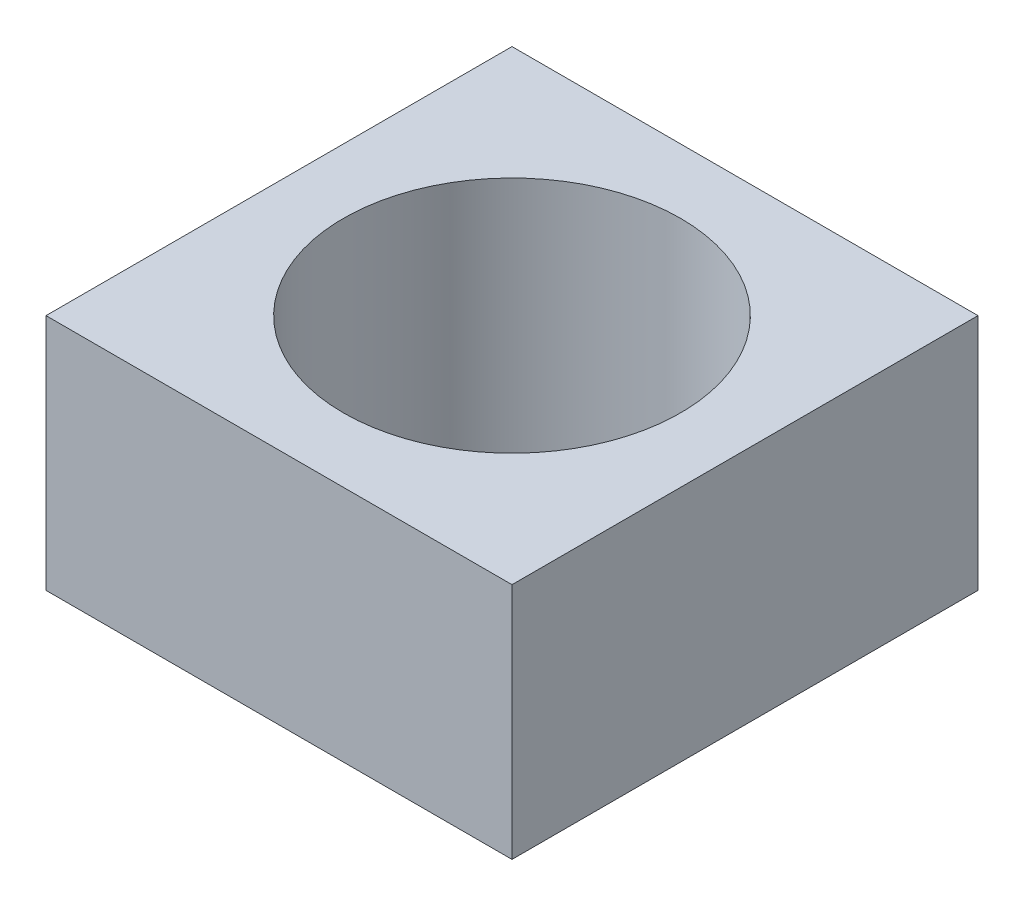
ISO-10303-21;
HEADER;
FILE_DESCRIPTION(('STEP AP214'),'2;1');
FILE_NAME('part.step','',(''),(''),'','','');
FILE_SCHEMA(('AUTOMOTIVE_DESIGN { 1 0 10303 214 1 1 1 1 }'));
ENDSEC;
DATA;
#1=APPLICATION_CONTEXT('core data for automotive mechanical design processes');
#2=APPLICATION_PROTOCOL_DEFINITION('international standard','automotive_design',2000,#1);
#3=PRODUCT_CONTEXT('',#1,'mechanical');
#4=PRODUCT('Part','Part','',(#3));
#5=PRODUCT_RELATED_PRODUCT_CATEGORY('part','',(#4));
#6=PRODUCT_DEFINITION_FORMATION('','',#4);
#7=PRODUCT_DEFINITION_CONTEXT('part definition',#1,'design');
#8=PRODUCT_DEFINITION('design','',#6,#7);
#9=PRODUCT_DEFINITION_SHAPE('','',#8);
#10=(LENGTH_UNIT() NAMED_UNIT(*) SI_UNIT(.MILLI.,.METRE.));
#11=(NAMED_UNIT(*) PLANE_ANGLE_UNIT() SI_UNIT($,.RADIAN.));
#12=(NAMED_UNIT(*) SI_UNIT($,.STERADIAN.) SOLID_ANGLE_UNIT());
#13=UNCERTAINTY_MEASURE_WITH_UNIT(LENGTH_MEASURE(1.E-05),#10,'distance_accuracy_value','');
#14=(GEOMETRIC_REPRESENTATION_CONTEXT(3) GLOBAL_UNCERTAINTY_ASSIGNED_CONTEXT((#13)) GLOBAL_UNIT_ASSIGNED_CONTEXT((#10,
#11,#12)) REPRESENTATION_CONTEXT('',''));
#15=CARTESIAN_POINT('',(0.,0.,0.));
#16=DIRECTION('',(0.,0.,1.));
#17=DIRECTION('',(1.,0.,0.));
#18=AXIS2_PLACEMENT_3D('',#15,#16,#17);
#19=CARTESIAN_POINT('',(37.30625,38.1,-37.30625));
#20=DIRECTION('',(-1.,0.,0.));
#21=DIRECTION('',(0.,0.,1.));
#22=AXIS2_PLACEMENT_3D('',#19,#20,#21);
#23=PLANE('',#22);
#24=DIRECTION('',(0.,0.,-1.));
#25=VECTOR('',#24,1.);
#26=CARTESIAN_POINT('',(37.30625,0.,-37.30625));
#27=LINE('',#26,#25);
#28=CARTESIAN_POINT('',(37.30625,0.,37.30625));
#29=VERTEX_POINT('',#28);
#30=CARTESIAN_POINT('',(37.30625,0.,-37.30625));
#31=VERTEX_POINT('',#30);
#32=EDGE_CURVE('E113',#29,#31,#27,.T.);
#33=ORIENTED_EDGE('',*,*,#32,.T.);
#34=DIRECTION('',(0.,-1.,0.));
#35=VECTOR('',#34,1.);
#36=CARTESIAN_POINT('',(37.30625,38.1,-37.30625));
#37=LINE('',#36,#35);
#38=CARTESIAN_POINT('',(37.30625,38.1,-37.30625));
#39=VERTEX_POINT('',#38);
#40=EDGE_CURVE('E11',#39,#31,#37,.T.);
#41=ORIENTED_EDGE('',*,*,#40,.F.);
#42=DIRECTION('',(0.,0.,-1.));
#43=VECTOR('',#42,1.);
#44=CARTESIAN_POINT('',(37.30625,38.1,-37.30625));
#45=LINE('',#44,#43);
#46=CARTESIAN_POINT('',(37.30625,38.1,37.30625));
#47=VERTEX_POINT('',#46);
#48=EDGE_CURVE('E97',#47,#39,#45,.T.);
#49=ORIENTED_EDGE('',*,*,#48,.F.);
#50=DIRECTION('',(0.,-1.,0.));
#51=VECTOR('',#50,1.);
#52=CARTESIAN_POINT('',(37.30625,38.1,37.30625));
#53=LINE('',#52,#51);
#54=EDGE_CURVE('E109',#47,#29,#53,.T.);
#55=ORIENTED_EDGE('',*,*,#54,.T.);
#56=EDGE_LOOP('',(#33,#41,#49,#55));
#57=FACE_BOUND('',#56,.T.);
#58=ADVANCED_FACE('F45',(#57),#23,.F.);
#59=CARTESIAN_POINT('',(-37.30625,38.1,-37.30625));
#60=DIRECTION('',(0.,0.,1.));
#61=DIRECTION('',(1.,0.,0.));
#62=AXIS2_PLACEMENT_3D('',#59,#60,#61);
#63=PLANE('',#62);
#64=DIRECTION('',(-1.,0.,0.));
#65=VECTOR('',#64,1.);
#66=CARTESIAN_POINT('',(-37.30625,0.,-37.30625));
#67=LINE('',#66,#65);
#68=CARTESIAN_POINT('',(-37.30625,0.,-37.30625));
#69=VERTEX_POINT('',#68);
#70=EDGE_CURVE('E102',#31,#69,#67,.T.);
#71=ORIENTED_EDGE('',*,*,#70,.T.);
#72=DIRECTION('',(0.,-1.,0.));
#73=VECTOR('',#72,1.);
#74=CARTESIAN_POINT('',(-37.30625,38.1,-37.30625));
#75=LINE('',#74,#73);
#76=CARTESIAN_POINT('',(-37.30625,38.1,-37.30625));
#77=VERTEX_POINT('',#76);
#78=EDGE_CURVE('E54',#77,#69,#75,.T.);
#79=ORIENTED_EDGE('',*,*,#78,.F.);
#80=DIRECTION('',(-1.,0.,0.));
#81=VECTOR('',#80,1.);
#82=CARTESIAN_POINT('',(-37.30625,38.1,-37.30625));
#83=LINE('',#82,#81);
#84=EDGE_CURVE('E92',#39,#77,#83,.T.);
#85=ORIENTED_EDGE('',*,*,#84,.F.);
#86=ORIENTED_EDGE('',*,*,#40,.T.);
#87=EDGE_LOOP('',(#71,#79,#85,#86));
#88=FACE_BOUND('',#87,.T.);
#89=ADVANCED_FACE('F101',(#88),#63,.F.);
#90=CARTESIAN_POINT('',(-37.30625,38.1,-37.30625));
#91=DIRECTION('',(1.,0.,0.));
#92=DIRECTION('',(0.,0.,-1.));
#93=AXIS2_PLACEMENT_3D('',#90,#91,#92);
#94=PLANE('',#93);
#95=DIRECTION('',(0.,0.,1.));
#96=VECTOR('',#95,1.);
#97=CARTESIAN_POINT('',(-37.30625,0.,-37.30625));
#98=LINE('',#97,#96);
#99=CARTESIAN_POINT('',(-37.30625,0.,37.30625));
#100=VERTEX_POINT('',#99);
#101=EDGE_CURVE('E79',#69,#100,#98,.T.);
#102=ORIENTED_EDGE('',*,*,#101,.T.);
#103=DIRECTION('',(0.,-1.,0.));
#104=VECTOR('',#103,1.);
#105=CARTESIAN_POINT('',(-37.30625,38.1,37.30625));
#106=LINE('',#105,#104);
#107=CARTESIAN_POINT('',(-37.30625,38.1,37.30625));
#108=VERTEX_POINT('',#107);
#109=EDGE_CURVE('E104',#108,#100,#106,.T.);
#110=ORIENTED_EDGE('',*,*,#109,.F.);
#111=DIRECTION('',(0.,0.,1.));
#112=VECTOR('',#111,1.);
#113=CARTESIAN_POINT('',(-37.30625,38.1,-37.30625));
#114=LINE('',#113,#112);
#115=EDGE_CURVE('E95',#77,#108,#114,.T.);
#116=ORIENTED_EDGE('',*,*,#115,.F.);
#117=ORIENTED_EDGE('',*,*,#78,.T.);
#118=EDGE_LOOP('',(#102,#110,#116,#117));
#119=FACE_BOUND('',#118,.T.);
#120=ADVANCED_FACE('F105',(#119),#94,.F.);
#121=CARTESIAN_POINT('',(-37.30625,38.1,37.30625));
#122=DIRECTION('',(0.,0.,-1.));
#123=DIRECTION('',(-1.,0.,0.));
#124=AXIS2_PLACEMENT_3D('',#121,#122,#123);
#125=PLANE('',#124);
#126=DIRECTION('',(1.,0.,0.));
#127=VECTOR('',#126,1.);
#128=CARTESIAN_POINT('',(-37.30625,0.,37.30625));
#129=LINE('',#128,#127);
#130=EDGE_CURVE('E85',#100,#29,#129,.T.);
#131=ORIENTED_EDGE('',*,*,#130,.T.);
#132=ORIENTED_EDGE('',*,*,#54,.F.);
#133=DIRECTION('',(1.,0.,0.));
#134=VECTOR('',#133,1.);
#135=CARTESIAN_POINT('',(-37.30625,38.1,37.30625));
#136=LINE('',#135,#134);
#137=EDGE_CURVE('E62',#108,#47,#136,.T.);
#138=ORIENTED_EDGE('',*,*,#137,.F.);
#139=ORIENTED_EDGE('',*,*,#109,.T.);
#140=EDGE_LOOP('',(#131,#132,#138,#139));
#141=FACE_BOUND('',#140,.T.);
#142=ADVANCED_FACE('F127',(#141),#125,.F.);
#143=CARTESIAN_POINT('',(0.,38.1,0.));
#144=DIRECTION('',(0.,1.,0.));
#145=DIRECTION('',(0.,0.,1.));
#146=AXIS2_PLACEMENT_3D('',#143,#144,#145);
#147=PLANE('',#146);
#148=CARTESIAN_POINT('',(0.,38.1,0.));
#149=DIRECTION('',(0.,1.,0.));
#150=DIRECTION('',(0.,0.,1.));
#151=AXIS2_PLACEMENT_3D('',#148,#149,#150);
#152=CIRCLE('',#151,26.9875);
#153=CARTESIAN_POINT('',(0.,38.1,26.9875));
#154=VERTEX_POINT('',#153);
#155=EDGE_CURVE('E134',#154,#154,#152,.T.);
#156=ORIENTED_EDGE('',*,*,#155,.F.);
#157=EDGE_LOOP('',(#156));
#158=FACE_BOUND('',#157,.T.);
#159=ORIENTED_EDGE('',*,*,#48,.T.);
#160=ORIENTED_EDGE('',*,*,#84,.T.);
#161=ORIENTED_EDGE('',*,*,#115,.T.);
#162=ORIENTED_EDGE('',*,*,#137,.T.);
#163=EDGE_LOOP('',(#159,#160,#161,#162));
#164=FACE_BOUND('',#163,.T.);
#165=ADVANCED_FACE('F93',(#158,#164),#147,.T.);
#166=CARTESIAN_POINT('',(0.,0.,0.));
#167=DIRECTION('',(0.,1.,0.));
#168=DIRECTION('',(0.,0.,1.));
#169=AXIS2_PLACEMENT_3D('',#166,#167,#168);
#170=PLANE('',#169);
#171=CARTESIAN_POINT('',(0.,0.,0.));
#172=DIRECTION('',(0.,1.,0.));
#173=DIRECTION('',(0.,0.,1.));
#174=AXIS2_PLACEMENT_3D('',#171,#172,#173);
#175=CIRCLE('',#174,26.9875);
#176=CARTESIAN_POINT('',(0.,0.,26.9875));
#177=VERTEX_POINT('',#176);
#178=EDGE_CURVE('E117',#177,#177,#175,.T.);
#179=ORIENTED_EDGE('',*,*,#178,.T.);
#180=EDGE_LOOP('',(#179));
#181=FACE_BOUND('',#180,.T.);
#182=ORIENTED_EDGE('',*,*,#32,.F.);
#183=ORIENTED_EDGE('',*,*,#130,.F.);
#184=ORIENTED_EDGE('',*,*,#101,.F.);
#185=ORIENTED_EDGE('',*,*,#70,.F.);
#186=EDGE_LOOP('',(#182,#183,#184,#185));
#187=FACE_BOUND('',#186,.T.);
#188=ADVANCED_FACE('F130',(#181,#187),#170,.F.);
#189=CARTESIAN_POINT('',(0.,0.,0.));
#190=DIRECTION('',(0.,1.,0.));
#191=DIRECTION('',(0.,0.,1.));
#192=AXIS2_PLACEMENT_3D('',#189,#190,#191);
#193=CYLINDRICAL_SURFACE('',#192,26.9875);
#194=CARTESIAN_POINT('',(0.,0.,26.9875));
#195=CARTESIAN_POINT('',(0.,0.396875,26.9875));
#196=CARTESIAN_POINT('',(0.,0.79375,26.9875));
#197=CARTESIAN_POINT('',(0.,1.5875,26.9875));
#198=CARTESIAN_POINT('',(0.,1.984375,26.9875));
#199=CARTESIAN_POINT('',(0.,2.778125,26.9875));
#200=CARTESIAN_POINT('',(0.,3.175,26.9875));
#201=CARTESIAN_POINT('',(0.,3.96875,26.9875));
#202=CARTESIAN_POINT('',(0.,4.365625,26.9875));
#203=CARTESIAN_POINT('',(0.,5.159375,26.9875));
#204=CARTESIAN_POINT('',(0.,5.55625,26.9875));
#205=CARTESIAN_POINT('',(0.,6.35,26.9875));
#206=CARTESIAN_POINT('',(0.,6.746875,26.9875));
#207=CARTESIAN_POINT('',(0.,7.540625,26.9875));
#208=CARTESIAN_POINT('',(0.,7.9375,26.9875));
#209=CARTESIAN_POINT('',(0.,8.73125,26.9875));
#210=CARTESIAN_POINT('',(0.,9.128125,26.9875));
#211=CARTESIAN_POINT('',(0.,9.921875,26.9875));
#212=CARTESIAN_POINT('',(0.,10.31875,26.9875));
#213=CARTESIAN_POINT('',(0.,11.1125,26.9875));
#214=CARTESIAN_POINT('',(0.,11.509375,26.9875));
#215=CARTESIAN_POINT('',(0.,12.303125,26.9875));
#216=CARTESIAN_POINT('',(0.,12.7,26.9875));
#217=CARTESIAN_POINT('',(0.,13.49375,26.9875));
#218=CARTESIAN_POINT('',(0.,13.890625,26.9875));
#219=CARTESIAN_POINT('',(0.,14.684375,26.9875));
#220=CARTESIAN_POINT('',(0.,15.08125,26.9875));
#221=CARTESIAN_POINT('',(0.,15.875,26.9875));
#222=CARTESIAN_POINT('',(0.,16.271875,26.9875));
#223=CARTESIAN_POINT('',(0.,17.065625,26.9875));
#224=CARTESIAN_POINT('',(0.,17.4625,26.9875));
#225=CARTESIAN_POINT('',(0.,18.25625,26.9875));
#226=CARTESIAN_POINT('',(0.,18.653125,26.9875));
#227=CARTESIAN_POINT('',(0.,19.446875,26.9875));
#228=CARTESIAN_POINT('',(0.,19.84375,26.9875));
#229=CARTESIAN_POINT('',(0.,20.6375,26.9875));
#230=CARTESIAN_POINT('',(0.,21.034375,26.9875));
#231=CARTESIAN_POINT('',(0.,21.828125,26.9875));
#232=CARTESIAN_POINT('',(0.,22.225,26.9875));
#233=CARTESIAN_POINT('',(0.,23.01875,26.9875));
#234=CARTESIAN_POINT('',(0.,23.415625,26.9875));
#235=CARTESIAN_POINT('',(0.,24.209375,26.9875));
#236=CARTESIAN_POINT('',(0.,24.60625,26.9875));
#237=CARTESIAN_POINT('',(0.,25.4,26.9875));
#238=CARTESIAN_POINT('',(0.,25.796875,26.9875));
#239=CARTESIAN_POINT('',(0.,26.590625,26.9875));
#240=CARTESIAN_POINT('',(0.,26.9875,26.9875));
#241=CARTESIAN_POINT('',(0.,27.78125,26.9875));
#242=CARTESIAN_POINT('',(0.,28.178125,26.9875));
#243=CARTESIAN_POINT('',(0.,28.971875,26.9875));
#244=CARTESIAN_POINT('',(0.,29.36875,26.9875));
#245=CARTESIAN_POINT('',(0.,30.1625,26.9875));
#246=CARTESIAN_POINT('',(0.,30.559375,26.9875));
#247=CARTESIAN_POINT('',(0.,31.353125,26.9875));
#248=CARTESIAN_POINT('',(0.,31.75,26.9875));
#249=CARTESIAN_POINT('',(0.,32.54375,26.9875));
#250=CARTESIAN_POINT('',(0.,32.940625,26.9875));
#251=CARTESIAN_POINT('',(0.,33.734375,26.9875));
#252=CARTESIAN_POINT('',(0.,34.13125,26.9875));
#253=CARTESIAN_POINT('',(0.,34.925,26.9875));
#254=CARTESIAN_POINT('',(0.,35.321875,26.9875));
#255=CARTESIAN_POINT('',(0.,36.115625,26.9875));
#256=CARTESIAN_POINT('',(0.,36.5125,26.9875));
#257=CARTESIAN_POINT('',(0.,37.30625,26.9875));
#258=CARTESIAN_POINT('',(0.,37.703125,26.9875));
#259=CARTESIAN_POINT('',(0.,38.1,26.9875));
#260=B_SPLINE_CURVE_WITH_KNOTS('',3,(#194,#195,#196,#197,#198,#199,#200,#201,#202,#203,#204,
#205,#206,#207,#208,#209,#210,#211,#212,#213,#214,#215,#216,#217,#218,#219,#220,#221,#222,#223,
#224,#225,#226,#227,#228,#229,#230,#231,#232,#233,#234,#235,#236,#237,#238,#239,#240,#241,#242,
#243,#244,#245,#246,#247,#248,#249,#250,#251,#252,#253,#254,#255,#256,#257,#258,#259),
.UNSPECIFIED.,.F.,.F.,(4,2,2,2,2,2,2,2,2,2,2,2,2,2,2,2,2,2,2,2,2,2,2,2,2,2,2,2,2,2,2,2,4),(0.,
1.190625,2.38125,3.571875,4.7625,5.953125,7.14375,8.334375,9.525,10.715625,11.90625,13.096875,
14.2875,15.478125,16.66875,17.859375,19.05,20.240625,21.43125,22.621875,23.8125,25.003125,
26.19375,27.384375,28.575,29.765625,30.95625,32.146875,33.3375,34.528125,35.71875,36.909375,
38.1),.UNSPECIFIED.);
#261=EDGE_CURVE('BSEAM143',#177,#154,#260,.T.);
#262=ORIENTED_EDGE('',*,*,#178,.F.);
#263=ORIENTED_EDGE('',*,*,#155,.T.);
#264=ORIENTED_EDGE('',*,*,#261,.T.);
#265=ORIENTED_EDGE('',*,*,#261,.F.);
#266=EDGE_LOOP('',(#262,#264,#263,#265));
#267=FACE_BOUND('',#266,.T.);
#268=ADVANCED_FACE('F143',(#267),#193,.F.);
#269=CLOSED_SHELL('',(#58,#89,#120,#142,#165,#188,#268));
#270=MANIFOLD_SOLID_BREP('B2',#269);
#271=ADVANCED_BREP_SHAPE_REPRESENTATION('',(#18,#270),#14);
#272=SHAPE_DEFINITION_REPRESENTATION(#9,#271);
ENDSEC;
END-ISO-10303-21;
